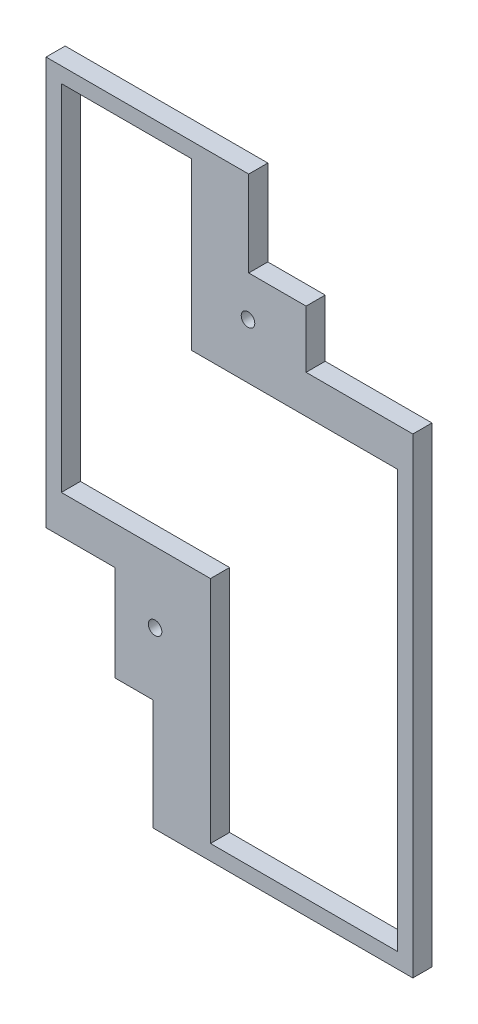
ISO-10303-21;
HEADER;
FILE_DESCRIPTION(('STEP AP214'),'2;1');
FILE_NAME('part.step','',(''),(''),'','','');
FILE_SCHEMA(('AUTOMOTIVE_DESIGN { 1 0 10303 214 1 1 1 1 }'));
ENDSEC;
DATA;
#1=APPLICATION_CONTEXT('core data for automotive mechanical design processes');
#2=APPLICATION_PROTOCOL_DEFINITION('international standard','automotive_design',2000,#1);
#3=PRODUCT_CONTEXT('',#1,'mechanical');
#4=PRODUCT('Part','Part','',(#3));
#5=PRODUCT_RELATED_PRODUCT_CATEGORY('part','',(#4));
#6=PRODUCT_DEFINITION_FORMATION('','',#4);
#7=PRODUCT_DEFINITION_CONTEXT('part definition',#1,'design');
#8=PRODUCT_DEFINITION('design','',#6,#7);
#9=PRODUCT_DEFINITION_SHAPE('','',#8);
#10=(LENGTH_UNIT() NAMED_UNIT(*) SI_UNIT(.MILLI.,.METRE.));
#11=(NAMED_UNIT(*) PLANE_ANGLE_UNIT() SI_UNIT($,.RADIAN.));
#12=(NAMED_UNIT(*) SI_UNIT($,.STERADIAN.) SOLID_ANGLE_UNIT());
#13=UNCERTAINTY_MEASURE_WITH_UNIT(LENGTH_MEASURE(1.E-05),#10,'distance_accuracy_value','');
#14=(GEOMETRIC_REPRESENTATION_CONTEXT(3) GLOBAL_UNCERTAINTY_ASSIGNED_CONTEXT((#13)) GLOBAL_UNIT_ASSIGNED_CONTEXT((#10,
#11,#12)) REPRESENTATION_CONTEXT('',''));
#15=CARTESIAN_POINT('',(0.,0.,0.));
#16=DIRECTION('',(0.,0.,1.));
#17=DIRECTION('',(1.,0.,0.));
#18=AXIS2_PLACEMENT_3D('',#15,#16,#17);
#19=CARTESIAN_POINT('',(0.,0.,6.35));
#20=DIRECTION('',(0.,0.,1.));
#21=DIRECTION('',(1.,0.,0.));
#22=AXIS2_PLACEMENT_3D('',#19,#20,#21);
#23=PLANE('',#22);
#24=CARTESIAN_POINT('',(9.53833525120018,-23.3763680856001,6.35));
#25=DIRECTION('',(0.,0.,1.));
#26=DIRECTION('',(1.,0.,0.));
#27=AXIS2_PLACEMENT_3D('',#24,#25,#26);
#28=CIRCLE('',#27,2.2479);
#29=CARTESIAN_POINT('',(11.7862352512002,-23.3763680856001,6.35));
#30=VERTEX_POINT('',#29);
#31=EDGE_CURVE('E597',#30,#30,#28,.T.);
#32=ORIENTED_EDGE('',*,*,#31,.F.);
#33=EDGE_LOOP('',(#32));
#34=FACE_BOUND('',#33,.T.);
#35=CARTESIAN_POINT('',(40.4027667732265,80.7284722729094,6.35));
#36=DIRECTION('',(0.,0.,1.));
#37=DIRECTION('',(1.,0.,0.));
#38=AXIS2_PLACEMENT_3D('',#35,#36,#37);
#39=CIRCLE('',#38,2.2479);
#40=CARTESIAN_POINT('',(42.6506667732265,80.7284722729094,6.35));
#41=VERTEX_POINT('',#40);
#42=EDGE_CURVE('E599',#41,#41,#39,.T.);
#43=ORIENTED_EDGE('',*,*,#42,.F.);
#44=EDGE_LOOP('',(#43));
#45=FACE_BOUND('',#44,.T.);
#46=DIRECTION('',(0.,-1.,0.));
#47=VECTOR('',#46,1.);
#48=CARTESIAN_POINT('',(-26.67,122.682,6.35));
#49=LINE('',#48,#47);
#50=CARTESIAN_POINT('',(-26.67,122.682,6.35));
#51=VERTEX_POINT('',#50);
#52=CARTESIAN_POINT('',(-26.67,-12.7,6.35));
#53=VERTEX_POINT('',#52);
#54=EDGE_CURVE('E237',#51,#53,#49,.T.);
#55=ORIENTED_EDGE('',*,*,#54,.T.);
#56=DIRECTION('',(1.,0.,0.));
#57=VECTOR('',#56,1.);
#58=CARTESIAN_POINT('',(-26.67,-12.7,6.35));
#59=LINE('',#58,#57);
#60=CARTESIAN_POINT('',(-3.80999999999995,-12.7,6.35));
#61=VERTEX_POINT('',#60);
#62=EDGE_CURVE('E240',#53,#61,#59,.T.);
#63=ORIENTED_EDGE('',*,*,#62,.T.);
#64=DIRECTION('',(0.,-1.,0.));
#65=VECTOR('',#64,1.);
#66=CARTESIAN_POINT('',(-3.80999999999995,-12.7,6.35));
#67=LINE('',#66,#65);
#68=CARTESIAN_POINT('',(-3.80999999999994,-44.45,6.35));
#69=VERTEX_POINT('',#68);
#70=EDGE_CURVE('E243',#61,#69,#67,.T.);
#71=ORIENTED_EDGE('',*,*,#70,.T.);
#72=DIRECTION('',(1.,0.,0.));
#73=VECTOR('',#72,1.);
#74=CARTESIAN_POINT('',(-3.80999999999994,-44.45,6.35));
#75=LINE('',#74,#73);
#76=CARTESIAN_POINT('',(8.89000000000005,-44.45,6.35));
#77=VERTEX_POINT('',#76);
#78=EDGE_CURVE('E245',#69,#77,#75,.T.);
#79=ORIENTED_EDGE('',*,*,#78,.T.);
#80=DIRECTION('',(0.,-1.,0.));
#81=VECTOR('',#80,1.);
#82=CARTESIAN_POINT('',(8.89000000000005,-44.45,6.35));
#83=LINE('',#82,#81);
#84=CARTESIAN_POINT('',(8.89000000000006,-81.28,6.35));
#85=VERTEX_POINT('',#84);
#86=EDGE_CURVE('E247',#77,#85,#83,.T.);
#87=ORIENTED_EDGE('',*,*,#86,.T.);
#88=DIRECTION('',(1.,0.,0.));
#89=VECTOR('',#88,1.);
#90=CARTESIAN_POINT('',(8.89000000000006,-81.28,6.35));
#91=LINE('',#90,#89);
#92=CARTESIAN_POINT('',(95.1484,-81.28,6.35));
#93=VERTEX_POINT('',#92);
#94=EDGE_CURVE('E249',#85,#93,#91,.T.);
#95=ORIENTED_EDGE('',*,*,#94,.T.);
#96=DIRECTION('',(0.,1.,0.));
#97=VECTOR('',#96,1.);
#98=CARTESIAN_POINT('',(95.1484,75.184,6.35));
#99=LINE('',#98,#97);
#100=CARTESIAN_POINT('',(95.1484,75.184,6.35));
#101=VERTEX_POINT('',#100);
#102=EDGE_CURVE('E251',#93,#101,#99,.T.);
#103=ORIENTED_EDGE('',*,*,#102,.T.);
#104=DIRECTION('',(-1.,0.,0.));
#105=VECTOR('',#104,1.);
#106=CARTESIAN_POINT('',(59.69,75.184,6.35));
#107=LINE('',#106,#105);
#108=CARTESIAN_POINT('',(59.69,75.184,6.35));
#109=VERTEX_POINT('',#108);
#110=EDGE_CURVE('E253',#101,#109,#107,.T.);
#111=ORIENTED_EDGE('',*,*,#110,.T.);
#112=DIRECTION('',(0.,1.,0.));
#113=VECTOR('',#112,1.);
#114=CARTESIAN_POINT('',(59.69,94.234,6.35));
#115=LINE('',#114,#113);
#116=CARTESIAN_POINT('',(59.69,94.234,6.35));
#117=VERTEX_POINT('',#116);
#118=EDGE_CURVE('E255',#109,#117,#115,.T.);
#119=ORIENTED_EDGE('',*,*,#118,.T.);
#120=DIRECTION('',(-1.,0.,0.));
#121=VECTOR('',#120,1.);
#122=CARTESIAN_POINT('',(40.64,94.234,6.35));
#123=LINE('',#122,#121);
#124=CARTESIAN_POINT('',(40.64,94.234,6.35));
#125=VERTEX_POINT('',#124);
#126=EDGE_CURVE('E257',#117,#125,#123,.T.);
#127=ORIENTED_EDGE('',*,*,#126,.T.);
#128=DIRECTION('',(0.,1.,0.));
#129=VECTOR('',#128,1.);
#130=CARTESIAN_POINT('',(40.64,122.682,6.35));
#131=LINE('',#130,#129);
#132=CARTESIAN_POINT('',(40.64,122.682,6.35));
#133=VERTEX_POINT('',#132);
#134=EDGE_CURVE('E259',#125,#133,#131,.T.);
#135=ORIENTED_EDGE('',*,*,#134,.T.);
#136=DIRECTION('',(-1.,0.,0.));
#137=VECTOR('',#136,1.);
#138=CARTESIAN_POINT('',(-26.67,122.682,6.35));
#139=LINE('',#138,#137);
#140=EDGE_CURVE('E261',#133,#51,#139,.T.);
#141=ORIENTED_EDGE('',*,*,#140,.T.);
#142=EDGE_LOOP('',(#55,#63,#71,#79,#87,#95,#103,#111,#119,#127,#135,#141));
#143=FACE_BOUND('',#142,.T.);
#144=DIRECTION('',(-1.,0.,0.));
#145=VECTOR('',#144,1.);
#146=CARTESIAN_POINT('',(90.0684000000001,62.484,6.35));
#147=LINE('',#146,#145);
#148=CARTESIAN_POINT('',(90.0684000000001,62.484,6.35));
#149=VERTEX_POINT('',#148);
#150=CARTESIAN_POINT('',(21.59,62.484,6.35));
#151=VERTEX_POINT('',#150);
#152=EDGE_CURVE('E177',#149,#151,#147,.T.);
#153=ORIENTED_EDGE('',*,*,#152,.F.);
#154=DIRECTION('',(0.,1.,0.));
#155=VECTOR('',#154,1.);
#156=CARTESIAN_POINT('',(90.0684,-76.2,6.35));
#157=LINE('',#156,#155);
#158=CARTESIAN_POINT('',(90.0684,-76.2,6.35));
#159=VERTEX_POINT('',#158);
#160=EDGE_CURVE('E169',#159,#149,#157,.T.);
#161=ORIENTED_EDGE('',*,*,#160,.F.);
#162=DIRECTION('',(1.,0.,0.));
#163=VECTOR('',#162,1.);
#164=CARTESIAN_POINT('',(27.94,-76.2,6.35));
#165=LINE('',#164,#163);
#166=CARTESIAN_POINT('',(27.94,-76.2,6.35));
#167=VERTEX_POINT('',#166);
#168=EDGE_CURVE('E203',#167,#159,#165,.T.);
#169=ORIENTED_EDGE('',*,*,#168,.F.);
#170=DIRECTION('',(0.,-1.,0.));
#171=VECTOR('',#170,1.);
#172=CARTESIAN_POINT('',(27.94,0.,6.35));
#173=LINE('',#172,#171);
#174=CARTESIAN_POINT('',(27.94,0.,6.35));
#175=VERTEX_POINT('',#174);
#176=EDGE_CURVE('E201',#175,#167,#173,.T.);
#177=ORIENTED_EDGE('',*,*,#176,.F.);
#178=DIRECTION('',(1.,0.,0.));
#179=VECTOR('',#178,1.);
#180=CARTESIAN_POINT('',(-21.59,0.,6.35));
#181=LINE('',#180,#179);
#182=CARTESIAN_POINT('',(-21.59,0.,6.35));
#183=VERTEX_POINT('',#182);
#184=EDGE_CURVE('E199',#183,#175,#181,.T.);
#185=ORIENTED_EDGE('',*,*,#184,.F.);
#186=DIRECTION('',(0.,-1.,0.));
#187=VECTOR('',#186,1.);
#188=CARTESIAN_POINT('',(-21.59,117.602,6.35));
#189=LINE('',#188,#187);
#190=CARTESIAN_POINT('',(-21.59,117.602,6.35));
#191=VERTEX_POINT('',#190);
#192=EDGE_CURVE('E197',#191,#183,#189,.T.);
#193=ORIENTED_EDGE('',*,*,#192,.F.);
#194=DIRECTION('',(-1.,0.,0.));
#195=VECTOR('',#194,1.);
#196=CARTESIAN_POINT('',(21.59,117.602,6.35));
#197=LINE('',#196,#195);
#198=CARTESIAN_POINT('',(21.59,117.602,6.35));
#199=VERTEX_POINT('',#198);
#200=EDGE_CURVE('E192',#199,#191,#197,.T.);
#201=ORIENTED_EDGE('',*,*,#200,.F.);
#202=DIRECTION('',(0.,1.,0.));
#203=VECTOR('',#202,1.);
#204=CARTESIAN_POINT('',(21.59,62.484,6.35));
#205=LINE('',#204,#203);
#206=EDGE_CURVE('E190',#151,#199,#205,.T.);
#207=ORIENTED_EDGE('',*,*,#206,.F.);
#208=EDGE_LOOP('',(#153,#161,#169,#177,#185,#193,#201,#207));
#209=FACE_BOUND('',#208,.T.);
#210=ADVANCED_FACE('F32',(#34,#45,#143,#209),#23,.T.);
#211=CARTESIAN_POINT('',(0.,0.,0.));
#212=DIRECTION('',(0.,0.,1.));
#213=DIRECTION('',(1.,0.,0.));
#214=AXIS2_PLACEMENT_3D('',#211,#212,#213);
#215=PLANE('',#214);
#216=CARTESIAN_POINT('',(9.53833525120018,-23.3763680856001,0.));
#217=DIRECTION('',(0.,0.,1.));
#218=DIRECTION('',(1.,0.,0.));
#219=AXIS2_PLACEMENT_3D('',#216,#217,#218);
#220=CIRCLE('',#219,2.2479);
#221=CARTESIAN_POINT('',(11.7862352512002,-23.3763680856001,0.));
#222=VERTEX_POINT('',#221);
#223=EDGE_CURVE('E595',#222,#222,#220,.T.);
#224=ORIENTED_EDGE('',*,*,#223,.T.);
#225=EDGE_LOOP('',(#224));
#226=FACE_BOUND('',#225,.T.);
#227=CARTESIAN_POINT('',(40.4027667732265,80.7284722729094,0.));
#228=DIRECTION('',(0.,0.,1.));
#229=DIRECTION('',(1.,0.,0.));
#230=AXIS2_PLACEMENT_3D('',#227,#228,#229);
#231=CIRCLE('',#230,2.2479);
#232=CARTESIAN_POINT('',(42.6506667732265,80.7284722729094,0.));
#233=VERTEX_POINT('',#232);
#234=EDGE_CURVE('E206',#233,#233,#231,.T.);
#235=ORIENTED_EDGE('',*,*,#234,.T.);
#236=EDGE_LOOP('',(#235));
#237=FACE_BOUND('',#236,.T.);
#238=DIRECTION('',(0.,-1.,0.));
#239=VECTOR('',#238,1.);
#240=CARTESIAN_POINT('',(-26.67,122.682,0.));
#241=LINE('',#240,#239);
#242=CARTESIAN_POINT('',(-26.67,122.682,0.));
#243=VERTEX_POINT('',#242);
#244=CARTESIAN_POINT('',(-26.67,-12.7,0.));
#245=VERTEX_POINT('',#244);
#246=EDGE_CURVE('E185',#243,#245,#241,.T.);
#247=ORIENTED_EDGE('',*,*,#246,.F.);
#248=DIRECTION('',(-1.,0.,0.));
#249=VECTOR('',#248,1.);
#250=CARTESIAN_POINT('',(-26.67,122.682,0.));
#251=LINE('',#250,#249);
#252=CARTESIAN_POINT('',(40.64,122.682,0.));
#253=VERTEX_POINT('',#252);
#254=EDGE_CURVE('E241',#253,#243,#251,.T.);
#255=ORIENTED_EDGE('',*,*,#254,.F.);
#256=DIRECTION('',(0.,1.,0.));
#257=VECTOR('',#256,1.);
#258=CARTESIAN_POINT('',(40.64,122.682,0.));
#259=LINE('',#258,#257);
#260=CARTESIAN_POINT('',(40.64,94.234,0.));
#261=VERTEX_POINT('',#260);
#262=EDGE_CURVE('E284',#261,#253,#259,.T.);
#263=ORIENTED_EDGE('',*,*,#262,.F.);
#264=DIRECTION('',(-1.,0.,0.));
#265=VECTOR('',#264,1.);
#266=CARTESIAN_POINT('',(40.64,94.234,0.));
#267=LINE('',#266,#265);
#268=CARTESIAN_POINT('',(59.69,94.234,0.));
#269=VERTEX_POINT('',#268);
#270=EDGE_CURVE('E282',#269,#261,#267,.T.);
#271=ORIENTED_EDGE('',*,*,#270,.F.);
#272=DIRECTION('',(0.,1.,0.));
#273=VECTOR('',#272,1.);
#274=CARTESIAN_POINT('',(59.69,94.234,0.));
#275=LINE('',#274,#273);
#276=CARTESIAN_POINT('',(59.69,75.184,0.));
#277=VERTEX_POINT('',#276);
#278=EDGE_CURVE('E280',#277,#269,#275,.T.);
#279=ORIENTED_EDGE('',*,*,#278,.F.);
#280=DIRECTION('',(-1.,0.,0.));
#281=VECTOR('',#280,1.);
#282=CARTESIAN_POINT('',(59.69,75.184,0.));
#283=LINE('',#282,#281);
#284=CARTESIAN_POINT('',(95.1484,75.184,0.));
#285=VERTEX_POINT('',#284);
#286=EDGE_CURVE('E278',#285,#277,#283,.T.);
#287=ORIENTED_EDGE('',*,*,#286,.F.);
#288=DIRECTION('',(0.,1.,0.));
#289=VECTOR('',#288,1.);
#290=CARTESIAN_POINT('',(95.1484,75.184,0.));
#291=LINE('',#290,#289);
#292=CARTESIAN_POINT('',(95.1484,-81.28,0.));
#293=VERTEX_POINT('',#292);
#294=EDGE_CURVE('E276',#293,#285,#291,.T.);
#295=ORIENTED_EDGE('',*,*,#294,.F.);
#296=DIRECTION('',(1.,0.,0.));
#297=VECTOR('',#296,1.);
#298=CARTESIAN_POINT('',(8.89000000000006,-81.28,0.));
#299=LINE('',#298,#297);
#300=CARTESIAN_POINT('',(8.89000000000006,-81.28,0.));
#301=VERTEX_POINT('',#300);
#302=EDGE_CURVE('E274',#301,#293,#299,.T.);
#303=ORIENTED_EDGE('',*,*,#302,.F.);
#304=DIRECTION('',(0.,-1.,0.));
#305=VECTOR('',#304,1.);
#306=CARTESIAN_POINT('',(8.89000000000005,-44.45,0.));
#307=LINE('',#306,#305);
#308=CARTESIAN_POINT('',(8.89000000000005,-44.45,0.));
#309=VERTEX_POINT('',#308);
#310=EDGE_CURVE('E272',#309,#301,#307,.T.);
#311=ORIENTED_EDGE('',*,*,#310,.F.);
#312=DIRECTION('',(1.,0.,0.));
#313=VECTOR('',#312,1.);
#314=CARTESIAN_POINT('',(-3.80999999999994,-44.45,0.));
#315=LINE('',#314,#313);
#316=CARTESIAN_POINT('',(-3.80999999999994,-44.45,0.));
#317=VERTEX_POINT('',#316);
#318=EDGE_CURVE('E270',#317,#309,#315,.T.);
#319=ORIENTED_EDGE('',*,*,#318,.F.);
#320=DIRECTION('',(0.,-1.,0.));
#321=VECTOR('',#320,1.);
#322=CARTESIAN_POINT('',(-3.80999999999995,-12.7,0.));
#323=LINE('',#322,#321);
#324=CARTESIAN_POINT('',(-3.80999999999995,-12.7,0.));
#325=VERTEX_POINT('',#324);
#326=EDGE_CURVE('E268',#325,#317,#323,.T.);
#327=ORIENTED_EDGE('',*,*,#326,.F.);
#328=DIRECTION('',(1.,0.,0.));
#329=VECTOR('',#328,1.);
#330=CARTESIAN_POINT('',(-26.67,-12.7,0.));
#331=LINE('',#330,#329);
#332=EDGE_CURVE('E266',#245,#325,#331,.T.);
#333=ORIENTED_EDGE('',*,*,#332,.F.);
#334=EDGE_LOOP('',(#247,#255,#263,#271,#279,#287,#295,#303,#311,#319,#327,#333));
#335=FACE_BOUND('',#334,.T.);
#336=DIRECTION('',(0.,1.,0.));
#337=VECTOR('',#336,1.);
#338=CARTESIAN_POINT('',(90.0684,-76.2,0.));
#339=LINE('',#338,#337);
#340=CARTESIAN_POINT('',(90.0684,-76.2,0.));
#341=VERTEX_POINT('',#340);
#342=CARTESIAN_POINT('',(90.0684000000001,62.484,0.));
#343=VERTEX_POINT('',#342);
#344=EDGE_CURVE('E55',#341,#343,#339,.T.);
#345=ORIENTED_EDGE('',*,*,#344,.T.);
#346=DIRECTION('',(-1.,0.,0.));
#347=VECTOR('',#346,1.);
#348=CARTESIAN_POINT('',(27.9400000000001,62.484,0.));
#349=LINE('',#348,#347);
#350=CARTESIAN_POINT('',(21.59,62.484,0.));
#351=VERTEX_POINT('',#350);
#352=EDGE_CURVE('E184',#343,#351,#349,.T.);
#353=ORIENTED_EDGE('',*,*,#352,.T.);
#354=DIRECTION('',(0.,1.,0.));
#355=VECTOR('',#354,1.);
#356=CARTESIAN_POINT('',(21.59,62.484,0.));
#357=LINE('',#356,#355);
#358=CARTESIAN_POINT('',(21.59,117.602,0.));
#359=VERTEX_POINT('',#358);
#360=EDGE_CURVE('E208',#351,#359,#357,.T.);
#361=ORIENTED_EDGE('',*,*,#360,.T.);
#362=DIRECTION('',(-1.,0.,0.));
#363=VECTOR('',#362,1.);
#364=CARTESIAN_POINT('',(21.59,117.602,0.));
#365=LINE('',#364,#363);
#366=CARTESIAN_POINT('',(-21.59,117.602,0.));
#367=VERTEX_POINT('',#366);
#368=EDGE_CURVE('E211',#359,#367,#365,.T.);
#369=ORIENTED_EDGE('',*,*,#368,.T.);
#370=DIRECTION('',(0.,-1.,0.));
#371=VECTOR('',#370,1.);
#372=CARTESIAN_POINT('',(-21.59,117.602,0.));
#373=LINE('',#372,#371);
#374=CARTESIAN_POINT('',(-21.59,0.,0.));
#375=VERTEX_POINT('',#374);
#376=EDGE_CURVE('E214',#367,#375,#373,.T.);
#377=ORIENTED_EDGE('',*,*,#376,.T.);
#378=DIRECTION('',(1.,0.,0.));
#379=VECTOR('',#378,1.);
#380=CARTESIAN_POINT('',(21.59,0.,0.));
#381=LINE('',#380,#379);
#382=CARTESIAN_POINT('',(27.94,0.,0.));
#383=VERTEX_POINT('',#382);
#384=EDGE_CURVE('E217',#375,#383,#381,.T.);
#385=ORIENTED_EDGE('',*,*,#384,.T.);
#386=DIRECTION('',(0.,-1.,0.));
#387=VECTOR('',#386,1.);
#388=CARTESIAN_POINT('',(27.94,0.,0.));
#389=LINE('',#388,#387);
#390=CARTESIAN_POINT('',(27.94,-76.2,0.));
#391=VERTEX_POINT('',#390);
#392=EDGE_CURVE('E220',#383,#391,#389,.T.);
#393=ORIENTED_EDGE('',*,*,#392,.T.);
#394=DIRECTION('',(1.,0.,0.));
#395=VECTOR('',#394,1.);
#396=CARTESIAN_POINT('',(27.94,-76.2,0.));
#397=LINE('',#396,#395);
#398=EDGE_CURVE('E178',#391,#341,#397,.T.);
#399=ORIENTED_EDGE('',*,*,#398,.T.);
#400=EDGE_LOOP('',(#345,#353,#361,#369,#377,#385,#393,#399));
#401=FACE_BOUND('',#400,.T.);
#402=ADVANCED_FACE('F326',(#226,#237,#335,#401),#215,.F.);
#403=CARTESIAN_POINT('',(-26.67,122.682,6.35));
#404=DIRECTION('',(1.,0.,0.));
#405=DIRECTION('',(0.,1.,0.));
#406=AXIS2_PLACEMENT_3D('',#403,#404,#405);
#407=PLANE('',#406);
#408=ORIENTED_EDGE('',*,*,#246,.T.);
#409=DIRECTION('',(0.,0.,-1.));
#410=VECTOR('',#409,1.);
#411=CARTESIAN_POINT('',(-26.67,-12.7,6.35));
#412=LINE('',#411,#410);
#413=EDGE_CURVE('E11',#53,#245,#412,.T.);
#414=ORIENTED_EDGE('',*,*,#413,.F.);
#415=ORIENTED_EDGE('',*,*,#54,.F.);
#416=DIRECTION('',(0.,0.,-1.));
#417=VECTOR('',#416,1.);
#418=CARTESIAN_POINT('',(-26.67,122.682,6.35));
#419=LINE('',#418,#417);
#420=EDGE_CURVE('E263',#51,#243,#419,.T.);
#421=ORIENTED_EDGE('',*,*,#420,.T.);
#422=EDGE_LOOP('',(#408,#414,#415,#421));
#423=FACE_BOUND('',#422,.T.);
#424=ADVANCED_FACE('F34',(#423),#407,.F.);
#425=CARTESIAN_POINT('',(-26.67,-12.7,6.35));
#426=DIRECTION('',(0.,1.,0.));
#427=DIRECTION('',(0.,0.,1.));
#428=AXIS2_PLACEMENT_3D('',#425,#426,#427);
#429=PLANE('',#428);
#430=ORIENTED_EDGE('',*,*,#332,.T.);
#431=DIRECTION('',(0.,0.,-1.));
#432=VECTOR('',#431,1.);
#433=CARTESIAN_POINT('',(-3.80999999999995,-12.7,6.35));
#434=LINE('',#433,#432);
#435=EDGE_CURVE('E40',#61,#325,#434,.T.);
#436=ORIENTED_EDGE('',*,*,#435,.F.);
#437=ORIENTED_EDGE('',*,*,#62,.F.);
#438=ORIENTED_EDGE('',*,*,#413,.T.);
#439=EDGE_LOOP('',(#430,#436,#437,#438));
#440=FACE_BOUND('',#439,.T.);
#441=ADVANCED_FACE('F343',(#440),#429,.F.);
#442=CARTESIAN_POINT('',(-3.80999999999995,-12.7,6.35));
#443=DIRECTION('',(1.,0.,0.));
#444=DIRECTION('',(0.,1.,0.));
#445=AXIS2_PLACEMENT_3D('',#442,#443,#444);
#446=PLANE('',#445);
#447=ORIENTED_EDGE('',*,*,#326,.T.);
#448=DIRECTION('',(0.,0.,-1.));
#449=VECTOR('',#448,1.);
#450=CARTESIAN_POINT('',(-3.80999999999994,-44.45,6.35));
#451=LINE('',#450,#449);
#452=EDGE_CURVE('E313',#69,#317,#451,.T.);
#453=ORIENTED_EDGE('',*,*,#452,.F.);
#454=ORIENTED_EDGE('',*,*,#70,.F.);
#455=ORIENTED_EDGE('',*,*,#435,.T.);
#456=EDGE_LOOP('',(#447,#453,#454,#455));
#457=FACE_BOUND('',#456,.T.);
#458=ADVANCED_FACE('F320',(#457),#446,.F.);
#459=CARTESIAN_POINT('',(-3.80999999999994,-44.45,6.35));
#460=DIRECTION('',(0.,1.,0.));
#461=DIRECTION('',(0.,0.,1.));
#462=AXIS2_PLACEMENT_3D('',#459,#460,#461);
#463=PLANE('',#462);
#464=ORIENTED_EDGE('',*,*,#318,.T.);
#465=DIRECTION('',(0.,0.,-1.));
#466=VECTOR('',#465,1.);
#467=CARTESIAN_POINT('',(8.89000000000005,-44.45,6.35));
#468=LINE('',#467,#466);
#469=EDGE_CURVE('E310',#77,#309,#468,.T.);
#470=ORIENTED_EDGE('',*,*,#469,.F.);
#471=ORIENTED_EDGE('',*,*,#78,.F.);
#472=ORIENTED_EDGE('',*,*,#452,.T.);
#473=EDGE_LOOP('',(#464,#470,#471,#472));
#474=FACE_BOUND('',#473,.T.);
#475=ADVANCED_FACE('F332',(#474),#463,.F.);
#476=CARTESIAN_POINT('',(8.89000000000005,-44.45,6.35));
#477=DIRECTION('',(1.,0.,0.));
#478=DIRECTION('',(0.,1.,0.));
#479=AXIS2_PLACEMENT_3D('',#476,#477,#478);
#480=PLANE('',#479);
#481=ORIENTED_EDGE('',*,*,#310,.T.);
#482=DIRECTION('',(0.,0.,-1.));
#483=VECTOR('',#482,1.);
#484=CARTESIAN_POINT('',(8.89000000000006,-81.28,6.35));
#485=LINE('',#484,#483);
#486=EDGE_CURVE('E307',#85,#301,#485,.T.);
#487=ORIENTED_EDGE('',*,*,#486,.F.);
#488=ORIENTED_EDGE('',*,*,#86,.F.);
#489=ORIENTED_EDGE('',*,*,#469,.T.);
#490=EDGE_LOOP('',(#481,#487,#488,#489));
#491=FACE_BOUND('',#490,.T.);
#492=ADVANCED_FACE('F336',(#491),#480,.F.);
#493=CARTESIAN_POINT('',(8.89000000000006,-81.28,6.35));
#494=DIRECTION('',(0.,1.,0.));
#495=DIRECTION('',(0.,0.,1.));
#496=AXIS2_PLACEMENT_3D('',#493,#494,#495);
#497=PLANE('',#496);
#498=ORIENTED_EDGE('',*,*,#302,.T.);
#499=DIRECTION('',(0.,0.,-1.));
#500=VECTOR('',#499,1.);
#501=CARTESIAN_POINT('',(95.1484,-81.28,6.35));
#502=LINE('',#501,#500);
#503=EDGE_CURVE('E304',#93,#293,#502,.T.);
#504=ORIENTED_EDGE('',*,*,#503,.F.);
#505=ORIENTED_EDGE('',*,*,#94,.F.);
#506=ORIENTED_EDGE('',*,*,#486,.T.);
#507=EDGE_LOOP('',(#498,#504,#505,#506));
#508=FACE_BOUND('',#507,.T.);
#509=ADVANCED_FACE('F376',(#508),#497,.F.);
#510=CARTESIAN_POINT('',(95.1484,75.184,6.35));
#511=DIRECTION('',(-1.,0.,0.));
#512=DIRECTION('',(0.,-1.,0.));
#513=AXIS2_PLACEMENT_3D('',#510,#511,#512);
#514=PLANE('',#513);
#515=ORIENTED_EDGE('',*,*,#294,.T.);
#516=DIRECTION('',(0.,0.,-1.));
#517=VECTOR('',#516,1.);
#518=CARTESIAN_POINT('',(95.1484,75.184,6.35));
#519=LINE('',#518,#517);
#520=EDGE_CURVE('E301',#101,#285,#519,.T.);
#521=ORIENTED_EDGE('',*,*,#520,.F.);
#522=ORIENTED_EDGE('',*,*,#102,.F.);
#523=ORIENTED_EDGE('',*,*,#503,.T.);
#524=EDGE_LOOP('',(#515,#521,#522,#523));
#525=FACE_BOUND('',#524,.T.);
#526=ADVANCED_FACE('F374',(#525),#514,.F.);
#527=CARTESIAN_POINT('',(59.69,75.184,6.35));
#528=DIRECTION('',(0.,-1.,0.));
#529=DIRECTION('',(0.,0.,-1.));
#530=AXIS2_PLACEMENT_3D('',#527,#528,#529);
#531=PLANE('',#530);
#532=ORIENTED_EDGE('',*,*,#286,.T.);
#533=DIRECTION('',(0.,0.,-1.));
#534=VECTOR('',#533,1.);
#535=CARTESIAN_POINT('',(59.69,75.184,6.35));
#536=LINE('',#535,#534);
#537=EDGE_CURVE('E298',#109,#277,#536,.T.);
#538=ORIENTED_EDGE('',*,*,#537,.F.);
#539=ORIENTED_EDGE('',*,*,#110,.F.);
#540=ORIENTED_EDGE('',*,*,#520,.T.);
#541=EDGE_LOOP('',(#532,#538,#539,#540));
#542=FACE_BOUND('',#541,.T.);
#543=ADVANCED_FACE('F370',(#542),#531,.F.);
#544=CARTESIAN_POINT('',(59.69,94.234,6.35));
#545=DIRECTION('',(-1.,0.,0.));
#546=DIRECTION('',(0.,0.,1.));
#547=AXIS2_PLACEMENT_3D('',#544,#545,#546);
#548=PLANE('',#547);
#549=ORIENTED_EDGE('',*,*,#278,.T.);
#550=DIRECTION('',(0.,0.,-1.));
#551=VECTOR('',#550,1.);
#552=CARTESIAN_POINT('',(59.69,94.234,6.35));
#553=LINE('',#552,#551);
#554=EDGE_CURVE('E295',#117,#269,#553,.T.);
#555=ORIENTED_EDGE('',*,*,#554,.F.);
#556=ORIENTED_EDGE('',*,*,#118,.F.);
#557=ORIENTED_EDGE('',*,*,#537,.T.);
#558=EDGE_LOOP('',(#549,#555,#556,#557));
#559=FACE_BOUND('',#558,.T.);
#560=ADVANCED_FACE('F365',(#559),#548,.F.);
#561=CARTESIAN_POINT('',(40.64,94.234,6.35));
#562=DIRECTION('',(0.,-1.,0.));
#563=DIRECTION('',(0.,0.,-1.));
#564=AXIS2_PLACEMENT_3D('',#561,#562,#563);
#565=PLANE('',#564);
#566=ORIENTED_EDGE('',*,*,#270,.T.);
#567=DIRECTION('',(0.,0.,-1.));
#568=VECTOR('',#567,1.);
#569=CARTESIAN_POINT('',(40.64,94.234,6.35));
#570=LINE('',#569,#568);
#571=EDGE_CURVE('E292',#125,#261,#570,.T.);
#572=ORIENTED_EDGE('',*,*,#571,.F.);
#573=ORIENTED_EDGE('',*,*,#126,.F.);
#574=ORIENTED_EDGE('',*,*,#554,.T.);
#575=EDGE_LOOP('',(#566,#572,#573,#574));
#576=FACE_BOUND('',#575,.T.);
#577=ADVANCED_FACE('F359',(#576),#565,.F.);
#578=CARTESIAN_POINT('',(40.64,122.682,6.35));
#579=DIRECTION('',(-1.,0.,0.));
#580=DIRECTION('',(0.,-1.,0.));
#581=AXIS2_PLACEMENT_3D('',#578,#579,#580);
#582=PLANE('',#581);
#583=ORIENTED_EDGE('',*,*,#262,.T.);
#584=DIRECTION('',(0.,0.,-1.));
#585=VECTOR('',#584,1.);
#586=CARTESIAN_POINT('',(40.64,122.682,6.35));
#587=LINE('',#586,#585);
#588=EDGE_CURVE('E289',#133,#253,#587,.T.);
#589=ORIENTED_EDGE('',*,*,#588,.F.);
#590=ORIENTED_EDGE('',*,*,#134,.F.);
#591=ORIENTED_EDGE('',*,*,#571,.T.);
#592=EDGE_LOOP('',(#583,#589,#590,#591));
#593=FACE_BOUND('',#592,.T.);
#594=ADVANCED_FACE('F355',(#593),#582,.F.);
#595=CARTESIAN_POINT('',(-26.67,122.682,6.35));
#596=DIRECTION('',(0.,-1.,0.));
#597=DIRECTION('',(0.,0.,-1.));
#598=AXIS2_PLACEMENT_3D('',#595,#596,#597);
#599=PLANE('',#598);
#600=ORIENTED_EDGE('',*,*,#254,.T.);
#601=ORIENTED_EDGE('',*,*,#420,.F.);
#602=ORIENTED_EDGE('',*,*,#140,.F.);
#603=ORIENTED_EDGE('',*,*,#588,.T.);
#604=EDGE_LOOP('',(#600,#601,#602,#603));
#605=FACE_BOUND('',#604,.T.);
#606=ADVANCED_FACE('F350',(#605),#599,.F.);
#607=CARTESIAN_POINT('',(90.0684,-76.2,6.35));
#608=DIRECTION('',(-1.,0.,0.));
#609=DIRECTION('',(0.,-1.,0.));
#610=AXIS2_PLACEMENT_3D('',#607,#608,#609);
#611=PLANE('',#610);
#612=ORIENTED_EDGE('',*,*,#344,.F.);
#613=DIRECTION('',(0.,0.,-1.));
#614=VECTOR('',#613,1.);
#615=CARTESIAN_POINT('',(90.0684,-76.2,6.35));
#616=LINE('',#615,#614);
#617=EDGE_CURVE('E173',#159,#341,#616,.T.);
#618=ORIENTED_EDGE('',*,*,#617,.F.);
#619=ORIENTED_EDGE('',*,*,#160,.T.);
#620=DIRECTION('',(0.,0.,-1.));
#621=VECTOR('',#620,1.);
#622=CARTESIAN_POINT('',(90.0684000000001,62.484,6.35));
#623=LINE('',#622,#621);
#624=EDGE_CURVE('E172',#149,#343,#623,.T.);
#625=ORIENTED_EDGE('',*,*,#624,.T.);
#626=EDGE_LOOP('',(#612,#618,#619,#625));
#627=FACE_BOUND('',#626,.T.);
#628=ADVANCED_FACE('F171',(#627),#611,.T.);
#629=CARTESIAN_POINT('',(27.9400000000001,62.484,6.35));
#630=DIRECTION('',(0.,-1.,0.));
#631=DIRECTION('',(1.,0.,0.));
#632=AXIS2_PLACEMENT_3D('',#629,#630,#631);
#633=PLANE('',#632);
#634=ORIENTED_EDGE('',*,*,#352,.F.);
#635=ORIENTED_EDGE('',*,*,#624,.F.);
#636=ORIENTED_EDGE('',*,*,#152,.T.);
#637=DIRECTION('',(0.,0.,-1.));
#638=VECTOR('',#637,1.);
#639=CARTESIAN_POINT('',(21.59,62.484,6.35));
#640=LINE('',#639,#638);
#641=EDGE_CURVE('E186',#151,#351,#640,.T.);
#642=ORIENTED_EDGE('',*,*,#641,.T.);
#643=EDGE_LOOP('',(#634,#635,#636,#642));
#644=FACE_BOUND('',#643,.T.);
#645=ADVANCED_FACE('F181',(#644),#633,.T.);
#646=CARTESIAN_POINT('',(21.59,62.484,6.35));
#647=DIRECTION('',(-1.,0.,0.));
#648=DIRECTION('',(0.,-1.,0.));
#649=AXIS2_PLACEMENT_3D('',#646,#647,#648);
#650=PLANE('',#649);
#651=ORIENTED_EDGE('',*,*,#360,.F.);
#652=ORIENTED_EDGE('',*,*,#641,.F.);
#653=ORIENTED_EDGE('',*,*,#206,.T.);
#654=DIRECTION('',(0.,0.,-1.));
#655=VECTOR('',#654,1.);
#656=CARTESIAN_POINT('',(21.59,117.602,6.35));
#657=LINE('',#656,#655);
#658=EDGE_CURVE('E234',#199,#359,#657,.T.);
#659=ORIENTED_EDGE('',*,*,#658,.T.);
#660=EDGE_LOOP('',(#651,#652,#653,#659));
#661=FACE_BOUND('',#660,.T.);
#662=ADVANCED_FACE('F438',(#661),#650,.T.);
#663=CARTESIAN_POINT('',(21.59,117.602,6.35));
#664=DIRECTION('',(0.,-1.,0.));
#665=DIRECTION('',(0.,0.,-1.));
#666=AXIS2_PLACEMENT_3D('',#663,#664,#665);
#667=PLANE('',#666);
#668=ORIENTED_EDGE('',*,*,#368,.F.);
#669=ORIENTED_EDGE('',*,*,#658,.F.);
#670=ORIENTED_EDGE('',*,*,#200,.T.);
#671=DIRECTION('',(0.,0.,-1.));
#672=VECTOR('',#671,1.);
#673=CARTESIAN_POINT('',(-21.59,117.602,6.35));
#674=LINE('',#673,#672);
#675=EDGE_CURVE('E232',#191,#367,#674,.T.);
#676=ORIENTED_EDGE('',*,*,#675,.T.);
#677=EDGE_LOOP('',(#668,#669,#670,#676));
#678=FACE_BOUND('',#677,.T.);
#679=ADVANCED_FACE('F444',(#678),#667,.T.);
#680=CARTESIAN_POINT('',(-21.59,117.602,6.35));
#681=DIRECTION('',(1.,0.,0.));
#682=DIRECTION('',(0.,1.,0.));
#683=AXIS2_PLACEMENT_3D('',#680,#681,#682);
#684=PLANE('',#683);
#685=ORIENTED_EDGE('',*,*,#376,.F.);
#686=ORIENTED_EDGE('',*,*,#675,.F.);
#687=ORIENTED_EDGE('',*,*,#192,.T.);
#688=DIRECTION('',(0.,0.,-1.));
#689=VECTOR('',#688,1.);
#690=CARTESIAN_POINT('',(-21.59,0.,6.35));
#691=LINE('',#690,#689);
#692=EDGE_CURVE('E229',#183,#375,#691,.T.);
#693=ORIENTED_EDGE('',*,*,#692,.T.);
#694=EDGE_LOOP('',(#685,#686,#687,#693));
#695=FACE_BOUND('',#694,.T.);
#696=ADVANCED_FACE('F452',(#695),#684,.T.);
#697=CARTESIAN_POINT('',(21.59,0.,6.35));
#698=DIRECTION('',(0.,1.,0.));
#699=DIRECTION('',(0.,0.,1.));
#700=AXIS2_PLACEMENT_3D('',#697,#698,#699);
#701=PLANE('',#700);
#702=ORIENTED_EDGE('',*,*,#384,.F.);
#703=ORIENTED_EDGE('',*,*,#692,.F.);
#704=ORIENTED_EDGE('',*,*,#184,.T.);
#705=DIRECTION('',(0.,0.,-1.));
#706=VECTOR('',#705,1.);
#707=CARTESIAN_POINT('',(27.94,0.,6.35));
#708=LINE('',#707,#706);
#709=EDGE_CURVE('E227',#175,#383,#708,.T.);
#710=ORIENTED_EDGE('',*,*,#709,.T.);
#711=EDGE_LOOP('',(#702,#703,#704,#710));
#712=FACE_BOUND('',#711,.T.);
#713=ADVANCED_FACE('F460',(#712),#701,.T.);
#714=CARTESIAN_POINT('',(27.94,0.,6.35));
#715=DIRECTION('',(1.,0.,0.));
#716=DIRECTION('',(0.,1.,0.));
#717=AXIS2_PLACEMENT_3D('',#714,#715,#716);
#718=PLANE('',#717);
#719=ORIENTED_EDGE('',*,*,#392,.F.);
#720=ORIENTED_EDGE('',*,*,#709,.F.);
#721=ORIENTED_EDGE('',*,*,#176,.T.);
#722=DIRECTION('',(0.,0.,-1.));
#723=VECTOR('',#722,1.);
#724=CARTESIAN_POINT('',(27.94,-76.2,6.35));
#725=LINE('',#724,#723);
#726=EDGE_CURVE('E47',#167,#391,#725,.T.);
#727=ORIENTED_EDGE('',*,*,#726,.T.);
#728=EDGE_LOOP('',(#719,#720,#721,#727));
#729=FACE_BOUND('',#728,.T.);
#730=ADVANCED_FACE('F468',(#729),#718,.T.);
#731=CARTESIAN_POINT('',(27.94,-76.2,6.35));
#732=DIRECTION('',(0.,1.,0.));
#733=DIRECTION('',(-1.,0.,0.));
#734=AXIS2_PLACEMENT_3D('',#731,#732,#733);
#735=PLANE('',#734);
#736=ORIENTED_EDGE('',*,*,#398,.F.);
#737=ORIENTED_EDGE('',*,*,#726,.F.);
#738=ORIENTED_EDGE('',*,*,#168,.T.);
#739=ORIENTED_EDGE('',*,*,#617,.T.);
#740=EDGE_LOOP('',(#736,#737,#738,#739));
#741=FACE_BOUND('',#740,.T.);
#742=ADVANCED_FACE('F476',(#741),#735,.T.);
#743=CARTESIAN_POINT('',(40.4027667732265,80.7284722729094,6.35));
#744=DIRECTION('',(0.,0.,1.));
#745=DIRECTION('',(1.,0.,0.));
#746=AXIS2_PLACEMENT_3D('',#743,#744,#745);
#747=CYLINDRICAL_SURFACE('',#746,2.2479);
#748=ORIENTED_EDGE('',*,*,#234,.F.);
#749=EDGE_LOOP('',(#748));
#750=FACE_BOUND('',#749,.T.);
#751=ORIENTED_EDGE('',*,*,#42,.T.);
#752=EDGE_LOOP('',(#751));
#753=FACE_BOUND('',#752,.T.);
#754=ADVANCED_FACE('F484',(#750,#753),#747,.F.);
#755=CARTESIAN_POINT('',(9.53833525120018,-23.3763680856001,6.35));
#756=DIRECTION('',(0.,0.,1.));
#757=DIRECTION('',(1.,0.,0.));
#758=AXIS2_PLACEMENT_3D('',#755,#756,#757);
#759=CYLINDRICAL_SURFACE('',#758,2.2479);
#760=ORIENTED_EDGE('',*,*,#223,.F.);
#761=EDGE_LOOP('',(#760));
#762=FACE_BOUND('',#761,.T.);
#763=ORIENTED_EDGE('',*,*,#31,.T.);
#764=EDGE_LOOP('',(#763));
#765=FACE_BOUND('',#764,.T.);
#766=ADVANCED_FACE('F491',(#762,#765),#759,.F.);
#767=CLOSED_SHELL('',(#210,#402,#424,#441,#458,#475,#492,#509,#526,#543,#560,#577,#594,#606,
#628,#645,#662,#679,#696,#713,#730,#742,#754,#766));
#768=MANIFOLD_SOLID_BREP('B2',#767);
#769=ADVANCED_BREP_SHAPE_REPRESENTATION('',(#18,#768),#14);
#770=SHAPE_DEFINITION_REPRESENTATION(#9,#769);
ENDSEC;
END-ISO-10303-21;
